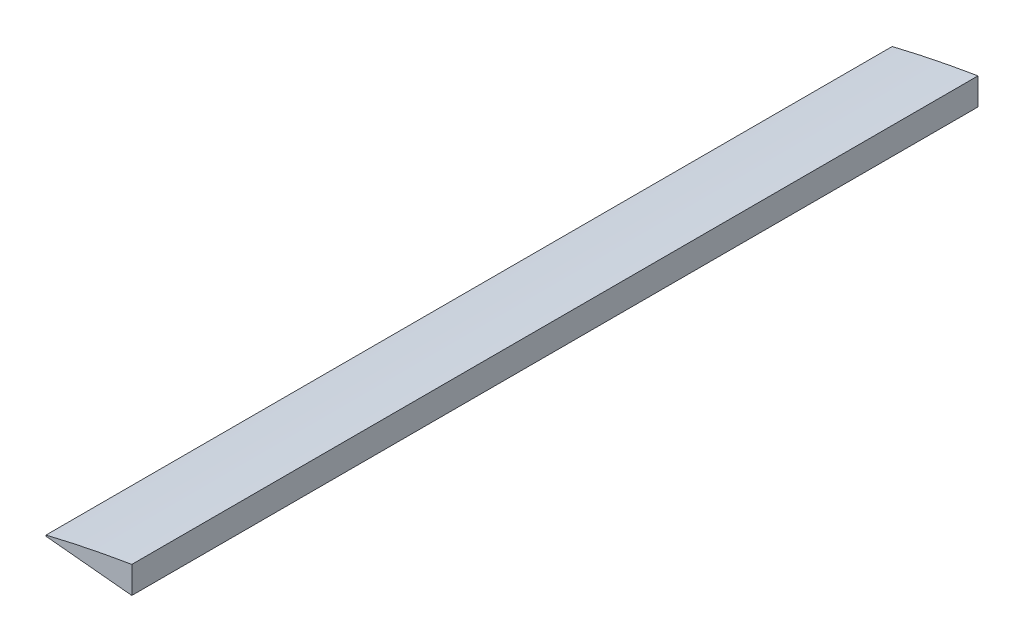
ISO-10303-21;
HEADER;
FILE_DESCRIPTION(('STEP AP214'),'2;1');
FILE_NAME('part.step','',(''),(''),'','','');
FILE_SCHEMA(('AUTOMOTIVE_DESIGN { 1 0 10303 214 1 1 1 1 }'));
ENDSEC;
DATA;
#1=APPLICATION_CONTEXT('core data for automotive mechanical design processes');
#2=APPLICATION_PROTOCOL_DEFINITION('international standard','automotive_design',2000,#1);
#3=PRODUCT_CONTEXT('',#1,'mechanical');
#4=PRODUCT('Part','Part','',(#3));
#5=PRODUCT_RELATED_PRODUCT_CATEGORY('part','',(#4));
#6=PRODUCT_DEFINITION_FORMATION('','',#4);
#7=PRODUCT_DEFINITION_CONTEXT('part definition',#1,'design');
#8=PRODUCT_DEFINITION('design','',#6,#7);
#9=PRODUCT_DEFINITION_SHAPE('','',#8);
#10=(LENGTH_UNIT() NAMED_UNIT(*) SI_UNIT(.MILLI.,.METRE.));
#11=(NAMED_UNIT(*) PLANE_ANGLE_UNIT() SI_UNIT($,.RADIAN.));
#12=(NAMED_UNIT(*) SI_UNIT($,.STERADIAN.) SOLID_ANGLE_UNIT());
#13=UNCERTAINTY_MEASURE_WITH_UNIT(LENGTH_MEASURE(1.E-05),#10,'distance_accuracy_value','');
#14=(GEOMETRIC_REPRESENTATION_CONTEXT(3) GLOBAL_UNCERTAINTY_ASSIGNED_CONTEXT((#13)) GLOBAL_UNIT_ASSIGNED_CONTEXT((#10,
#11,#12)) REPRESENTATION_CONTEXT('',''));
#15=CARTESIAN_POINT('',(0.,0.,0.));
#16=DIRECTION('',(0.,0.,1.));
#17=DIRECTION('',(1.,0.,0.));
#18=AXIS2_PLACEMENT_3D('',#15,#16,#17);
#19=CARTESIAN_POINT('',(-176.6195,13.0231065320779,-612.));
#20=CARTESIAN_POINT('',(-178.431906242409,12.7225140893475,-612.));
#21=CARTESIAN_POINT('',(-182.841851446798,11.9911128337809,-612.));
#22=CARTESIAN_POINT('',(-189.692146989018,10.7707979995533,-612.));
#23=CARTESIAN_POINT('',(-197.014934224044,9.41071051545085,-612.));
#24=CARTESIAN_POINT('',(-203.853700549821,8.07964962665863,-612.));
#25=CARTESIAN_POINT('',(-210.168190110976,6.80035046257828,-612.));
#26=CARTESIAN_POINT('',(-215.920851846762,5.59131319395077,-612.));
#27=CARTESIAN_POINT('',(-221.07784499836,4.47147753876463,-612.));
#28=CARTESIAN_POINT('',(-225.608999593441,3.45873579653939,-612.));
#29=CARTESIAN_POINT('',(-229.487989994805,2.56984486442563,-612.));
#30=CARTESIAN_POINT('',(-232.692417392676,1.81993810894559,-612.));
#31=CARTESIAN_POINT('',(-235.203893788734,1.22216361948841,-612.));
#32=CARTESIAN_POINT('',(-237.008061316891,0.787162185068913,-612.));
#33=CARTESIAN_POINT('',(-238.086350230103,0.525005253363324,-612.));
#34=CARTESIAN_POINT('',(-238.56211597697,0.408767052233491,-612.));
#35=CARTESIAN_POINT('',(-238.675,0.381187437980616,-612.));
#36=B_SPLINE_CURVE_WITH_KNOTS('',3,(#19,#20,#21,#22,#23,#24,#25,#26,#27,#28,#29,#30,#31,#32,#33,
#34,#35),.UNSPECIFIED.,.F.,.F.,(4,1,1,1,1,1,1,1,1,1,1,1,1,1,4),(0.,0.0870070051452906,
0.21170536500617,0.329527112719374,0.439740644540536,0.541660709078569,0.634652346186561,
0.718134668905483,0.791584505134145,0.854539888493236,0.906603358473801,0.947445002011979,
0.976805146454737,0.994496601743555,1.),.UNSPECIFIED.);
#37=DIRECTION('',(0.,0.,1.));
#38=VECTOR('',#37,1.);
#39=SURFACE_OF_LINEAR_EXTRUSION('',#36,#38);
#40=CARTESIAN_POINT('',(-176.6195,13.0231065320779,0.));
#41=CARTESIAN_POINT('',(-178.431906242409,12.7225140893475,0.));
#42=CARTESIAN_POINT('',(-182.841851446798,11.9911128337809,0.));
#43=CARTESIAN_POINT('',(-189.692146989018,10.7707979995533,0.));
#44=CARTESIAN_POINT('',(-197.014934224044,9.41071051545085,0.));
#45=CARTESIAN_POINT('',(-203.853700549821,8.07964962665863,0.));
#46=CARTESIAN_POINT('',(-210.168190110976,6.80035046257828,0.));
#47=CARTESIAN_POINT('',(-215.920851846762,5.59131319395077,0.));
#48=CARTESIAN_POINT('',(-221.07784499836,4.47147753876463,0.));
#49=CARTESIAN_POINT('',(-225.608999593441,3.45873579653939,0.));
#50=CARTESIAN_POINT('',(-229.487989994805,2.56984486442563,0.));
#51=CARTESIAN_POINT('',(-232.692417392676,1.81993810894559,0.));
#52=CARTESIAN_POINT('',(-235.203893788734,1.22216361948841,0.));
#53=CARTESIAN_POINT('',(-237.008061316891,0.787162185068913,0.));
#54=CARTESIAN_POINT('',(-238.086350230103,0.525005253363324,0.));
#55=CARTESIAN_POINT('',(-238.56211597697,0.408767052233491,0.));
#56=CARTESIAN_POINT('',(-238.675,0.381187437980616,0.));
#57=B_SPLINE_CURVE_WITH_KNOTS('',3,(#40,#41,#42,#43,#44,#45,#46,#47,#48,#49,#50,#51,#52,#53,#54,
#55,#56),.UNSPECIFIED.,.F.,.F.,(4,1,1,1,1,1,1,1,1,1,1,1,1,1,4),(0.,0.0870070051452906,
0.21170536500617,0.329527112719374,0.439740644540536,0.541660709078569,0.634652346186561,
0.718134668905483,0.791584505134145,0.854539888493236,0.906603358473801,0.947445002011979,
0.976805146454737,0.994496601743555,1.),.UNSPECIFIED.);
#58=CARTESIAN_POINT('',(-176.6195,13.0231065320779,0.));
#59=VERTEX_POINT('',#58);
#60=CARTESIAN_POINT('',(-238.675,0.381187437980616,0.));
#61=VERTEX_POINT('',#60);
#62=EDGE_CURVE('E128',#59,#61,#57,.T.);
#63=ORIENTED_EDGE('',*,*,#62,.F.);
#64=DIRECTION('',(0.,0.,1.));
#65=VECTOR('',#64,1.);
#66=CARTESIAN_POINT('',(-176.6195,13.0231065320779,-612.));
#67=LINE('',#66,#65);
#68=CARTESIAN_POINT('',(-176.6195,13.0231065320779,-612.));
#69=VERTEX_POINT('',#68);
#70=EDGE_CURVE('E11',#69,#59,#67,.T.);
#71=ORIENTED_EDGE('',*,*,#70,.F.);
#72=CARTESIAN_POINT('',(-238.675,0.381187437980616,-612.));
#73=VERTEX_POINT('',#72);
#74=EDGE_CURVE('E98',#69,#73,#36,.T.);
#75=ORIENTED_EDGE('',*,*,#74,.T.);
#76=DIRECTION('',(0.,0.,1.));
#77=VECTOR('',#76,1.);
#78=CARTESIAN_POINT('',(-238.675,0.381187437980616,-612.));
#79=LINE('',#78,#77);
#80=EDGE_CURVE('E43',#73,#61,#79,.T.);
#81=ORIENTED_EDGE('',*,*,#80,.T.);
#82=EDGE_LOOP('',(#63,#71,#75,#81));
#83=FACE_BOUND('',#82,.T.);
#84=ADVANCED_FACE('F39',(#83),#39,.T.);
#85=CARTESIAN_POINT('',(-176.6195,13.0231065320779,-612.));
#86=DIRECTION('',(1.,0.,0.));
#87=DIRECTION('',(0.,0.,-1.));
#88=AXIS2_PLACEMENT_3D('',#85,#86,#87);
#89=PLANE('',#88);
#90=DIRECTION('',(0.,1.,0.));
#91=VECTOR('',#90,1.);
#92=CARTESIAN_POINT('',(-176.6195,13.0231065320779,0.));
#93=LINE('',#92,#91);
#94=CARTESIAN_POINT('',(-176.6195,-6.45437050587714,0.));
#95=VERTEX_POINT('',#94);
#96=EDGE_CURVE('E100',#95,#59,#93,.T.);
#97=ORIENTED_EDGE('',*,*,#96,.F.);
#98=DIRECTION('',(0.,0.,1.));
#99=VECTOR('',#98,1.);
#100=CARTESIAN_POINT('',(-176.6195,-6.45437050587714,-612.));
#101=LINE('',#100,#99);
#102=CARTESIAN_POINT('',(-176.6195,-6.45437050587714,-612.));
#103=VERTEX_POINT('',#102);
#104=EDGE_CURVE('E49',#103,#95,#101,.T.);
#105=ORIENTED_EDGE('',*,*,#104,.F.);
#106=DIRECTION('',(0.,1.,0.));
#107=VECTOR('',#106,1.);
#108=CARTESIAN_POINT('',(-176.6195,13.0231065320779,-612.));
#109=LINE('',#108,#107);
#110=EDGE_CURVE('E95',#103,#69,#109,.T.);
#111=ORIENTED_EDGE('',*,*,#110,.T.);
#112=ORIENTED_EDGE('',*,*,#70,.T.);
#113=EDGE_LOOP('',(#97,#105,#111,#112));
#114=FACE_BOUND('',#113,.T.);
#115=ADVANCED_FACE('F115',(#114),#89,.T.);
#116=CARTESIAN_POINT('',(-238.675,-0.37508053676849,-612.));
#117=CARTESIAN_POINT('',(-238.666663292953,-0.375050863072437,-612.));
#118=CARTESIAN_POINT('',(-238.533564190899,-0.374577109793465,-612.));
#119=CARTESIAN_POINT('',(-238.031628616167,-0.459131062713866,-612.));
#120=CARTESIAN_POINT('',(-236.918777596443,-0.548714441337481,-612.));
#121=CARTESIAN_POINT('',(-235.075678545615,-0.760955177260776,-612.));
#122=CARTESIAN_POINT('',(-232.510834876333,-1.02388030775304,-612.));
#123=CARTESIAN_POINT('',(-229.242958683435,-1.36749412414823,-612.));
#124=CARTESIAN_POINT('',(-225.292785947233,-1.77365183159583,-612.));
#125=CARTESIAN_POINT('',(-220.686424708719,-2.24255830933729,-612.));
#126=CARTESIAN_POINT('',(-215.453758548078,-2.76722608353814,-612.));
#127=CARTESIAN_POINT('',(-209.628692319637,-3.34283622928186,-612.));
#128=CARTESIAN_POINT('',(-203.248712281771,-3.96362697663763,-612.));
#129=CARTESIAN_POINT('',(-196.354680807535,-4.6241750576377,-612.));
#130=CARTESIAN_POINT('',(-188.990421054401,-5.31788609211773,-612.));
#131=CARTESIAN_POINT('',(-182.359886545966,-5.93397090632641,-612.));
#132=CARTESIAN_POINT('',(-178.1887534817,-6.31210850367031,-612.));
#133=CARTESIAN_POINT('',(-176.6195,-6.45437050587714,-612.));
#134=B_SPLINE_CURVE_WITH_KNOTS('',3,(#116,#117,#118,#119,#120,#121,#122,#123,#124,#125,#126,
#127,#128,#129,#130,#131,#132,#133),.UNSPECIFIED.,.F.,.F.,(4,1,1,1,1,1,1,1,1,1,1,1,1,1,1,4),(0.,
0.000401027004237497,0.00640256804801387,0.0243667405419059,0.0541726551316404,
0.0956203448841404,0.148432949269866,0.212259606924723,0.286678920603446,0.371202853061501,
0.465280924763118,0.568304609739684,0.67961185947699,0.798491720853711,0.924189047970984,1.),.UNSPECIFIED.);
#135=DIRECTION('',(0.,0.,1.));
#136=VECTOR('',#135,1.);
#137=SURFACE_OF_LINEAR_EXTRUSION('',#134,#136);
#138=CARTESIAN_POINT('',(-238.675,-0.37508053676849,0.));
#139=CARTESIAN_POINT('',(-238.666663292953,-0.375050863072437,0.));
#140=CARTESIAN_POINT('',(-238.533564190899,-0.374577109793465,0.));
#141=CARTESIAN_POINT('',(-238.031628616167,-0.459131062713866,0.));
#142=CARTESIAN_POINT('',(-236.918777596443,-0.548714441337481,0.));
#143=CARTESIAN_POINT('',(-235.075678545615,-0.760955177260776,0.));
#144=CARTESIAN_POINT('',(-232.510834876333,-1.02388030775304,0.));
#145=CARTESIAN_POINT('',(-229.242958683435,-1.36749412414823,0.));
#146=CARTESIAN_POINT('',(-225.292785947233,-1.77365183159583,0.));
#147=CARTESIAN_POINT('',(-220.686424708719,-2.24255830933729,0.));
#148=CARTESIAN_POINT('',(-215.453758548078,-2.76722608353814,0.));
#149=CARTESIAN_POINT('',(-209.628692319637,-3.34283622928186,0.));
#150=CARTESIAN_POINT('',(-203.248712281771,-3.96362697663763,0.));
#151=CARTESIAN_POINT('',(-196.354680807535,-4.6241750576377,0.));
#152=CARTESIAN_POINT('',(-188.990421054401,-5.31788609211773,0.));
#153=CARTESIAN_POINT('',(-182.359886545966,-5.93397090632641,0.));
#154=CARTESIAN_POINT('',(-178.1887534817,-6.31210850367031,0.));
#155=CARTESIAN_POINT('',(-176.6195,-6.45437050587714,0.));
#156=B_SPLINE_CURVE_WITH_KNOTS('',3,(#138,#139,#140,#141,#142,#143,#144,#145,#146,#147,#148,
#149,#150,#151,#152,#153,#154,#155),.UNSPECIFIED.,.F.,.F.,(4,1,1,1,1,1,1,1,1,1,1,1,1,1,1,4),(0.,
0.000401027004237497,0.00640256804801387,0.0243667405419059,0.0541726551316404,
0.0956203448841404,0.148432949269866,0.212259606924723,0.286678920603446,0.371202853061501,
0.465280924763118,0.568304609739684,0.67961185947699,0.798491720853711,0.924189047970984,1.),.UNSPECIFIED.);
#157=CARTESIAN_POINT('',(-238.675,-0.37508053676849,0.));
#158=VERTEX_POINT('',#157);
#159=EDGE_CURVE('E90',#158,#95,#156,.T.);
#160=ORIENTED_EDGE('',*,*,#159,.F.);
#161=DIRECTION('',(0.,0.,1.));
#162=VECTOR('',#161,1.);
#163=CARTESIAN_POINT('',(-238.675,-0.37508053676849,-612.));
#164=LINE('',#163,#162);
#165=CARTESIAN_POINT('',(-238.675,-0.37508053676849,-612.));
#166=VERTEX_POINT('',#165);
#167=EDGE_CURVE('E85',#166,#158,#164,.T.);
#168=ORIENTED_EDGE('',*,*,#167,.F.);
#169=EDGE_CURVE('E88',#166,#103,#134,.T.);
#170=ORIENTED_EDGE('',*,*,#169,.T.);
#171=ORIENTED_EDGE('',*,*,#104,.T.);
#172=EDGE_LOOP('',(#160,#168,#170,#171));
#173=FACE_BOUND('',#172,.T.);
#174=ADVANCED_FACE('F87',(#173),#137,.T.);
#175=CARTESIAN_POINT('',(-238.675,0.381187437980616,-612.));
#176=DIRECTION('',(-1.,0.,0.));
#177=DIRECTION('',(0.,0.,1.));
#178=AXIS2_PLACEMENT_3D('',#175,#176,#177);
#179=PLANE('',#178);
#180=DIRECTION('',(0.,-1.,0.));
#181=VECTOR('',#180,1.);
#182=CARTESIAN_POINT('',(-238.675,0.381187437980616,0.));
#183=LINE('',#182,#181);
#184=EDGE_CURVE('E131',#61,#158,#183,.T.);
#185=ORIENTED_EDGE('',*,*,#184,.F.);
#186=ORIENTED_EDGE('',*,*,#80,.F.);
#187=DIRECTION('',(0.,-1.,0.));
#188=VECTOR('',#187,1.);
#189=CARTESIAN_POINT('',(-238.675,0.381187437980616,-612.));
#190=LINE('',#189,#188);
#191=EDGE_CURVE('E94',#73,#166,#190,.T.);
#192=ORIENTED_EDGE('',*,*,#191,.T.);
#193=ORIENTED_EDGE('',*,*,#167,.T.);
#194=EDGE_LOOP('',(#185,#186,#192,#193));
#195=FACE_BOUND('',#194,.T.);
#196=ADVANCED_FACE('F97',(#195),#179,.T.);
#197=CARTESIAN_POINT('',(-207.766040944377,7.28474410354639,-612.));
#198=DIRECTION('',(0.,0.,-1.));
#199=DIRECTION('',(-1.,0.,0.));
#200=AXIS2_PLACEMENT_3D('',#197,#198,#199);
#201=PLANE('',#200);
#202=ORIENTED_EDGE('',*,*,#74,.F.);
#203=ORIENTED_EDGE('',*,*,#110,.F.);
#204=ORIENTED_EDGE('',*,*,#169,.F.);
#205=ORIENTED_EDGE('',*,*,#191,.F.);
#206=EDGE_LOOP('',(#202,#203,#204,#205));
#207=FACE_BOUND('',#206,.T.);
#208=ADVANCED_FACE('F93',(#207),#201,.T.);
#209=CARTESIAN_POINT('',(-207.766040944377,7.28474410354639,0.));
#210=DIRECTION('',(0.,0.,-1.));
#211=DIRECTION('',(-1.,0.,0.));
#212=AXIS2_PLACEMENT_3D('',#209,#210,#211);
#213=PLANE('',#212);
#214=ORIENTED_EDGE('',*,*,#62,.T.);
#215=ORIENTED_EDGE('',*,*,#184,.T.);
#216=ORIENTED_EDGE('',*,*,#159,.T.);
#217=ORIENTED_EDGE('',*,*,#96,.T.);
#218=EDGE_LOOP('',(#214,#215,#216,#217));
#219=FACE_BOUND('',#218,.T.);
#220=ADVANCED_FACE('F121',(#219),#213,.F.);
#221=CLOSED_SHELL('',(#84,#115,#174,#196,#208,#220));
#222=MANIFOLD_SOLID_BREP('B2',#221);
#223=ADVANCED_BREP_SHAPE_REPRESENTATION('',(#18,#222),#14);
#224=SHAPE_DEFINITION_REPRESENTATION(#9,#223);
ENDSEC;
END-ISO-10303-21;
